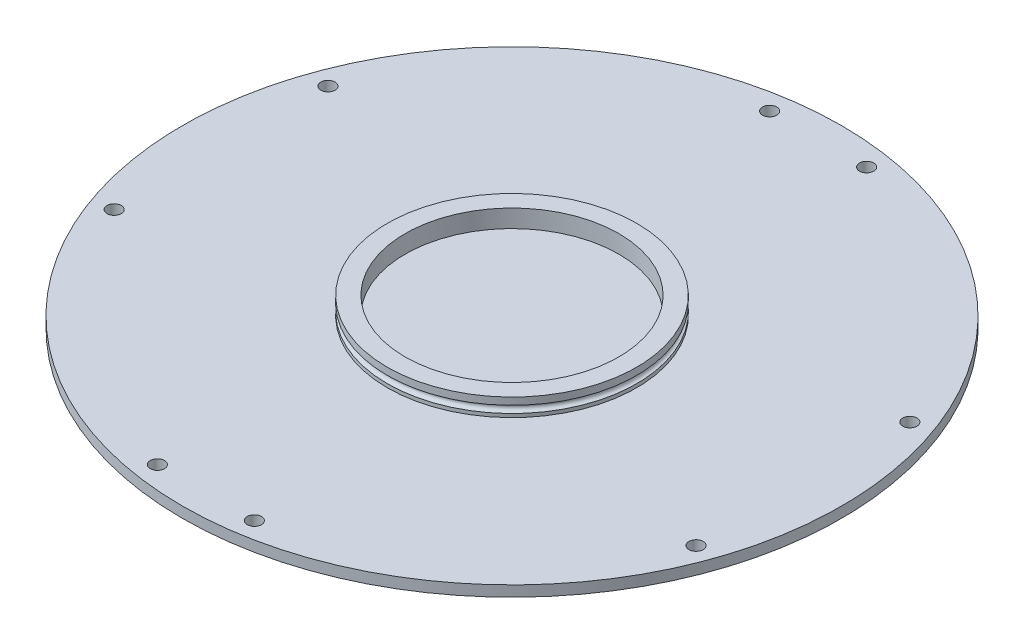
ISO-10303-21;
HEADER;
FILE_DESCRIPTION(('STEP AP214'),'2;1');
FILE_NAME('part.step','',(''),(''),'','','');
FILE_SCHEMA(('AUTOMOTIVE_DESIGN { 1 0 10303 214 1 1 1 1 }'));
ENDSEC;
DATA;
#1=APPLICATION_CONTEXT('core data for automotive mechanical design processes');
#2=APPLICATION_PROTOCOL_DEFINITION('international standard','automotive_design',2000,#1);
#3=PRODUCT_CONTEXT('',#1,'mechanical');
#4=PRODUCT('Part','Part','',(#3));
#5=PRODUCT_RELATED_PRODUCT_CATEGORY('part','',(#4));
#6=PRODUCT_DEFINITION_FORMATION('','',#4);
#7=PRODUCT_DEFINITION_CONTEXT('part definition',#1,'design');
#8=PRODUCT_DEFINITION('design','',#6,#7);
#9=PRODUCT_DEFINITION_SHAPE('','',#8);
#10=(LENGTH_UNIT() NAMED_UNIT(*) SI_UNIT(.MILLI.,.METRE.));
#11=(NAMED_UNIT(*) PLANE_ANGLE_UNIT() SI_UNIT($,.RADIAN.));
#12=(NAMED_UNIT(*) SI_UNIT($,.STERADIAN.) SOLID_ANGLE_UNIT());
#13=UNCERTAINTY_MEASURE_WITH_UNIT(LENGTH_MEASURE(1.E-05),#10,'distance_accuracy_value','');
#14=(GEOMETRIC_REPRESENTATION_CONTEXT(3) GLOBAL_UNCERTAINTY_ASSIGNED_CONTEXT((#13)) GLOBAL_UNIT_ASSIGNED_CONTEXT((#10,
#11,#12)) REPRESENTATION_CONTEXT('',''));
#15=CARTESIAN_POINT('',(0.,0.,0.));
#16=DIRECTION('',(0.,0.,1.));
#17=DIRECTION('',(1.,0.,0.));
#18=AXIS2_PLACEMENT_3D('',#15,#16,#17);
#19=CARTESIAN_POINT('',(0.,8.,0.));
#20=DIRECTION('',(0.,-1.,0.));
#21=DIRECTION('',(0.,0.,-1.));
#22=AXIS2_PLACEMENT_3D('',#19,#20,#21);
#23=CYLINDRICAL_SURFACE('',#22,35.);
#24=CARTESIAN_POINT('',(0.,4.,0.));
#25=DIRECTION('',(0.,-1.,0.));
#26=DIRECTION('',(0.,0.,-1.));
#27=AXIS2_PLACEMENT_3D('',#24,#25,#26);
#28=CIRCLE('',#27,35.);
#29=CARTESIAN_POINT('',(0.,4.,-35.));
#30=VERTEX_POINT('',#29);
#31=EDGE_CURVE('E174',#30,#30,#28,.T.);
#32=ORIENTED_EDGE('',*,*,#31,.T.);
#33=EDGE_LOOP('',(#32));
#34=FACE_BOUND('',#33,.T.);
#35=CARTESIAN_POINT('',(0.,3.,0.));
#36=DIRECTION('',(0.,1.,0.));
#37=DIRECTION('',(0.,0.,1.));
#38=AXIS2_PLACEMENT_3D('',#35,#36,#37);
#39=CIRCLE('',#38,35.);
#40=CARTESIAN_POINT('',(0.,3.,35.));
#41=VERTEX_POINT('',#40);
#42=EDGE_CURVE('E97',#41,#41,#39,.T.);
#43=ORIENTED_EDGE('',*,*,#42,.T.);
#44=EDGE_LOOP('',(#43));
#45=FACE_BOUND('',#44,.T.);
#46=ADVANCED_FACE('F39',(#34,#45),#23,.T.);
#47=CARTESIAN_POINT('',(0.,3.,0.));
#48=DIRECTION('',(0.,-1.,0.));
#49=DIRECTION('',(0.,0.,-1.));
#50=AXIS2_PLACEMENT_3D('',#47,#48,#49);
#51=CYLINDRICAL_SURFACE('',#50,92.5);
#52=CARTESIAN_POINT('',(0.,3.,0.));
#53=DIRECTION('',(0.,1.,0.));
#54=DIRECTION('',(0.,0.,1.));
#55=AXIS2_PLACEMENT_3D('',#52,#53,#54);
#56=CIRCLE('',#55,92.5);
#57=CARTESIAN_POINT('',(0.,3.,92.5));
#58=VERTEX_POINT('',#57);
#59=EDGE_CURVE('E46',#58,#58,#56,.T.);
#60=ORIENTED_EDGE('',*,*,#59,.F.);
#61=EDGE_LOOP('',(#60));
#62=FACE_BOUND('',#61,.T.);
#63=CARTESIAN_POINT('',(0.,0.,0.));
#64=DIRECTION('',(0.,1.,0.));
#65=DIRECTION('',(0.,0.,1.));
#66=AXIS2_PLACEMENT_3D('',#63,#64,#65);
#67=CIRCLE('',#66,92.5);
#68=CARTESIAN_POINT('',(0.,0.,92.5));
#69=VERTEX_POINT('',#68);
#70=EDGE_CURVE('E83',#69,#69,#67,.T.);
#71=ORIENTED_EDGE('',*,*,#70,.T.);
#72=EDGE_LOOP('',(#71));
#73=FACE_BOUND('',#72,.T.);
#74=ADVANCED_FACE('F129',(#62,#73),#51,.T.);
#75=CARTESIAN_POINT('',(-81.6639455328972,3.,-30.));
#76=DIRECTION('',(0.,-1.,0.));
#77=DIRECTION('',(0.,0.,-1.));
#78=AXIS2_PLACEMENT_3D('',#75,#76,#77);
#79=CYLINDRICAL_SURFACE('',#78,2.);
#80=CARTESIAN_POINT('',(-81.6639455328972,3.,-30.));
#81=DIRECTION('',(0.,1.,0.));
#82=DIRECTION('',(0.,0.,1.));
#83=AXIS2_PLACEMENT_3D('',#80,#81,#82);
#84=CIRCLE('',#83,2.);
#85=CARTESIAN_POINT('',(-81.6639455328972,3.,-28.));
#86=VERTEX_POINT('',#85);
#87=EDGE_CURVE('E50',#86,#86,#84,.T.);
#88=ORIENTED_EDGE('',*,*,#87,.T.);
#89=EDGE_LOOP('',(#88));
#90=FACE_BOUND('',#89,.T.);
#91=CARTESIAN_POINT('',(-81.6639455328972,0.,-30.));
#92=DIRECTION('',(0.,1.,0.));
#93=DIRECTION('',(0.,0.,1.));
#94=AXIS2_PLACEMENT_3D('',#91,#92,#93);
#95=CIRCLE('',#94,2.);
#96=CARTESIAN_POINT('',(-81.6639455328972,0.,-28.));
#97=VERTEX_POINT('',#96);
#98=EDGE_CURVE('E81',#97,#97,#95,.T.);
#99=ORIENTED_EDGE('',*,*,#98,.F.);
#100=EDGE_LOOP('',(#99));
#101=FACE_BOUND('',#100,.T.);
#102=ADVANCED_FACE('F126',(#90,#101),#79,.F.);
#103=CARTESIAN_POINT('',(81.6639455328972,3.,-30.));
#104=DIRECTION('',(0.,-1.,0.));
#105=DIRECTION('',(0.,0.,-1.));
#106=AXIS2_PLACEMENT_3D('',#103,#104,#105);
#107=CYLINDRICAL_SURFACE('',#106,2.);
#108=CARTESIAN_POINT('',(81.6639455328972,3.,-30.));
#109=DIRECTION('',(0.,1.,0.));
#110=DIRECTION('',(0.,0.,1.));
#111=AXIS2_PLACEMENT_3D('',#108,#109,#110);
#112=CIRCLE('',#111,2.);
#113=CARTESIAN_POINT('',(81.6639455328972,3.,-28.));
#114=VERTEX_POINT('',#113);
#115=EDGE_CURVE('E55',#114,#114,#112,.T.);
#116=ORIENTED_EDGE('',*,*,#115,.T.);
#117=EDGE_LOOP('',(#116));
#118=FACE_BOUND('',#117,.T.);
#119=CARTESIAN_POINT('',(81.6639455328972,0.,-30.));
#120=DIRECTION('',(0.,1.,0.));
#121=DIRECTION('',(0.,0.,1.));
#122=AXIS2_PLACEMENT_3D('',#119,#120,#121);
#123=CIRCLE('',#122,2.);
#124=CARTESIAN_POINT('',(81.6639455328972,0.,-28.));
#125=VERTEX_POINT('',#124);
#126=EDGE_CURVE('E78',#125,#125,#123,.T.);
#127=ORIENTED_EDGE('',*,*,#126,.F.);
#128=EDGE_LOOP('',(#127));
#129=FACE_BOUND('',#128,.T.);
#130=ADVANCED_FACE('F113',(#118,#129),#107,.F.);
#131=CARTESIAN_POINT('',(13.6097984585005,3.,-85.9288856317769));
#132=DIRECTION('',(0.,-1.,0.));
#133=DIRECTION('',(0.,0.,-1.));
#134=AXIS2_PLACEMENT_3D('',#131,#132,#133);
#135=CYLINDRICAL_SURFACE('',#134,2.);
#136=CARTESIAN_POINT('',(13.6097984585005,3.,-85.9288856317769));
#137=DIRECTION('',(0.,1.,0.));
#138=DIRECTION('',(0.,0.,1.));
#139=AXIS2_PLACEMENT_3D('',#136,#137,#138);
#140=CIRCLE('',#139,2.);
#141=CARTESIAN_POINT('',(13.6097984585005,3.,-83.9288856317769));
#142=VERTEX_POINT('',#141);
#143=EDGE_CURVE('E108',#142,#142,#140,.T.);
#144=ORIENTED_EDGE('',*,*,#143,.T.);
#145=EDGE_LOOP('',(#144));
#146=FACE_BOUND('',#145,.T.);
#147=CARTESIAN_POINT('',(13.6097984585005,0.,-85.9288856317769));
#148=DIRECTION('',(0.,1.,0.));
#149=DIRECTION('',(0.,0.,1.));
#150=AXIS2_PLACEMENT_3D('',#147,#148,#149);
#151=CIRCLE('',#150,2.);
#152=CARTESIAN_POINT('',(13.6097984585005,0.,-83.9288856317769));
#153=VERTEX_POINT('',#152);
#154=EDGE_CURVE('E75',#153,#153,#151,.T.);
#155=ORIENTED_EDGE('',*,*,#154,.F.);
#156=EDGE_LOOP('',(#155));
#157=FACE_BOUND('',#156,.T.);
#158=ADVANCED_FACE('F275',(#146,#157),#135,.F.);
#159=CARTESIAN_POINT('',(13.6097984585005,3.,85.9288856317769));
#160=DIRECTION('',(0.,-1.,0.));
#161=DIRECTION('',(0.,0.,-1.));
#162=AXIS2_PLACEMENT_3D('',#159,#160,#161);
#163=CYLINDRICAL_SURFACE('',#162,2.);
#164=CARTESIAN_POINT('',(13.6097984585005,3.,85.9288856317769));
#165=DIRECTION('',(0.,1.,0.));
#166=DIRECTION('',(0.,0.,1.));
#167=AXIS2_PLACEMENT_3D('',#164,#165,#166);
#168=CIRCLE('',#167,2.);
#169=CARTESIAN_POINT('',(13.6097984585005,3.,87.9288856317769));
#170=VERTEX_POINT('',#169);
#171=EDGE_CURVE('E105',#170,#170,#168,.T.);
#172=ORIENTED_EDGE('',*,*,#171,.T.);
#173=EDGE_LOOP('',(#172));
#174=FACE_BOUND('',#173,.T.);
#175=CARTESIAN_POINT('',(13.6097984585005,0.,85.9288856317769));
#176=DIRECTION('',(0.,1.,0.));
#177=DIRECTION('',(0.,0.,1.));
#178=AXIS2_PLACEMENT_3D('',#175,#176,#177);
#179=CIRCLE('',#178,2.);
#180=CARTESIAN_POINT('',(13.6097984585005,0.,87.9288856317769));
#181=VERTEX_POINT('',#180);
#182=EDGE_CURVE('E72',#181,#181,#179,.T.);
#183=ORIENTED_EDGE('',*,*,#182,.F.);
#184=EDGE_LOOP('',(#183));
#185=FACE_BOUND('',#184,.T.);
#186=ADVANCED_FACE('F265',(#174,#185),#163,.F.);
#187=CARTESIAN_POINT('',(-13.6097984585005,3.,-85.9288856317769));
#188=DIRECTION('',(0.,-1.,0.));
#189=DIRECTION('',(0.,0.,-1.));
#190=AXIS2_PLACEMENT_3D('',#187,#188,#189);
#191=CYLINDRICAL_SURFACE('',#190,1.99999999999994);
#192=CARTESIAN_POINT('',(-13.6097984585005,3.,-85.9288856317769));
#193=DIRECTION('',(0.,1.,0.));
#194=DIRECTION('',(0.,0.,1.));
#195=AXIS2_PLACEMENT_3D('',#192,#193,#194);
#196=CIRCLE('',#195,1.99999999999994);
#197=CARTESIAN_POINT('',(-13.6097984585005,3.,-83.928885631777));
#198=VERTEX_POINT('',#197);
#199=EDGE_CURVE('E102',#198,#198,#196,.T.);
#200=ORIENTED_EDGE('',*,*,#199,.T.);
#201=EDGE_LOOP('',(#200));
#202=FACE_BOUND('',#201,.T.);
#203=CARTESIAN_POINT('',(-13.6097984585005,0.,-85.9288856317769));
#204=DIRECTION('',(0.,1.,0.));
#205=DIRECTION('',(0.,0.,1.));
#206=AXIS2_PLACEMENT_3D('',#203,#204,#205);
#207=CIRCLE('',#206,1.99999999999994);
#208=CARTESIAN_POINT('',(-13.6097984585005,0.,-83.928885631777));
#209=VERTEX_POINT('',#208);
#210=EDGE_CURVE('E69',#209,#209,#207,.T.);
#211=ORIENTED_EDGE('',*,*,#210,.F.);
#212=EDGE_LOOP('',(#211));
#213=FACE_BOUND('',#212,.T.);
#214=ADVANCED_FACE('F255',(#202,#213),#191,.F.);
#215=CARTESIAN_POINT('',(-13.6097984585005,3.,85.9288856317769));
#216=DIRECTION('',(0.,-1.,0.));
#217=DIRECTION('',(0.,0.,-1.));
#218=AXIS2_PLACEMENT_3D('',#215,#216,#217);
#219=CYLINDRICAL_SURFACE('',#218,1.99999999999996);
#220=CARTESIAN_POINT('',(-13.6097984585005,3.,85.9288856317769));
#221=DIRECTION('',(0.,1.,0.));
#222=DIRECTION('',(0.,0.,1.));
#223=AXIS2_PLACEMENT_3D('',#220,#221,#222);
#224=CIRCLE('',#223,1.99999999999996);
#225=CARTESIAN_POINT('',(-13.6097984585005,3.,87.9288856317769));
#226=VERTEX_POINT('',#225);
#227=EDGE_CURVE('E94',#226,#226,#224,.T.);
#228=ORIENTED_EDGE('',*,*,#227,.T.);
#229=EDGE_LOOP('',(#228));
#230=FACE_BOUND('',#229,.T.);
#231=CARTESIAN_POINT('',(-13.6097984585005,0.,85.9288856317769));
#232=DIRECTION('',(0.,1.,0.));
#233=DIRECTION('',(0.,0.,1.));
#234=AXIS2_PLACEMENT_3D('',#231,#232,#233);
#235=CIRCLE('',#234,1.99999999999996);
#236=CARTESIAN_POINT('',(-13.6097984585005,0.,87.9288856317769));
#237=VERTEX_POINT('',#236);
#238=EDGE_CURVE('E66',#237,#237,#235,.T.);
#239=ORIENTED_EDGE('',*,*,#238,.F.);
#240=EDGE_LOOP('',(#239));
#241=FACE_BOUND('',#240,.T.);
#242=ADVANCED_FACE('F246',(#230,#241),#219,.F.);
#243=CARTESIAN_POINT('',(81.6639455328972,3.,30.));
#244=DIRECTION('',(0.,-1.,0.));
#245=DIRECTION('',(0.,0.,-1.));
#246=AXIS2_PLACEMENT_3D('',#243,#244,#245);
#247=CYLINDRICAL_SURFACE('',#246,2.);
#248=CARTESIAN_POINT('',(81.6639455328972,3.,30.));
#249=DIRECTION('',(0.,1.,0.));
#250=DIRECTION('',(0.,0.,1.));
#251=AXIS2_PLACEMENT_3D('',#248,#249,#250);
#252=CIRCLE('',#251,2.);
#253=CARTESIAN_POINT('',(81.6639455328972,3.,32.));
#254=VERTEX_POINT('',#253);
#255=EDGE_CURVE('E89',#254,#254,#252,.T.);
#256=ORIENTED_EDGE('',*,*,#255,.T.);
#257=EDGE_LOOP('',(#256));
#258=FACE_BOUND('',#257,.T.);
#259=CARTESIAN_POINT('',(81.6639455328972,0.,30.));
#260=DIRECTION('',(0.,1.,0.));
#261=DIRECTION('',(0.,0.,1.));
#262=AXIS2_PLACEMENT_3D('',#259,#260,#261);
#263=CIRCLE('',#262,2.);
#264=CARTESIAN_POINT('',(81.6639455328972,0.,32.));
#265=VERTEX_POINT('',#264);
#266=EDGE_CURVE('E62',#265,#265,#263,.T.);
#267=ORIENTED_EDGE('',*,*,#266,.F.);
#268=EDGE_LOOP('',(#267));
#269=FACE_BOUND('',#268,.T.);
#270=ADVANCED_FACE('F140',(#258,#269),#247,.F.);
#271=CARTESIAN_POINT('',(-81.6639455328972,3.,30.));
#272=DIRECTION('',(0.,-1.,0.));
#273=DIRECTION('',(0.,0.,-1.));
#274=AXIS2_PLACEMENT_3D('',#271,#272,#273);
#275=CYLINDRICAL_SURFACE('',#274,2.);
#276=CARTESIAN_POINT('',(-81.6639455328972,3.,30.));
#277=DIRECTION('',(0.,1.,0.));
#278=DIRECTION('',(0.,0.,1.));
#279=AXIS2_PLACEMENT_3D('',#276,#277,#278);
#280=CIRCLE('',#279,2.);
#281=CARTESIAN_POINT('',(-81.6639455328972,3.,32.));
#282=VERTEX_POINT('',#281);
#283=EDGE_CURVE('E85',#282,#282,#280,.T.);
#284=ORIENTED_EDGE('',*,*,#283,.T.);
#285=EDGE_LOOP('',(#284));
#286=FACE_BOUND('',#285,.T.);
#287=CARTESIAN_POINT('',(-81.6639455328972,0.,30.));
#288=DIRECTION('',(0.,1.,0.));
#289=DIRECTION('',(0.,0.,1.));
#290=AXIS2_PLACEMENT_3D('',#287,#288,#289);
#291=CIRCLE('',#290,2.);
#292=CARTESIAN_POINT('',(-81.6639455328972,0.,32.));
#293=VERTEX_POINT('',#292);
#294=EDGE_CURVE('E59',#293,#293,#291,.T.);
#295=ORIENTED_EDGE('',*,*,#294,.F.);
#296=EDGE_LOOP('',(#295));
#297=FACE_BOUND('',#296,.T.);
#298=ADVANCED_FACE('F41',(#286,#297),#275,.F.);
#299=CARTESIAN_POINT('',(0.,0.,0.));
#300=DIRECTION('',(0.,1.,0.));
#301=DIRECTION('',(0.,0.,1.));
#302=AXIS2_PLACEMENT_3D('',#299,#300,#301);
#303=PLANE('',#302);
#304=ORIENTED_EDGE('',*,*,#294,.T.);
#305=EDGE_LOOP('',(#304));
#306=FACE_BOUND('',#305,.T.);
#307=ORIENTED_EDGE('',*,*,#266,.T.);
#308=EDGE_LOOP('',(#307));
#309=FACE_BOUND('',#308,.T.);
#310=ORIENTED_EDGE('',*,*,#238,.T.);
#311=EDGE_LOOP('',(#310));
#312=FACE_BOUND('',#311,.T.);
#313=ORIENTED_EDGE('',*,*,#210,.T.);
#314=EDGE_LOOP('',(#313));
#315=FACE_BOUND('',#314,.T.);
#316=ORIENTED_EDGE('',*,*,#182,.T.);
#317=EDGE_LOOP('',(#316));
#318=FACE_BOUND('',#317,.T.);
#319=ORIENTED_EDGE('',*,*,#154,.T.);
#320=EDGE_LOOP('',(#319));
#321=FACE_BOUND('',#320,.T.);
#322=ORIENTED_EDGE('',*,*,#126,.T.);
#323=EDGE_LOOP('',(#322));
#324=FACE_BOUND('',#323,.T.);
#325=ORIENTED_EDGE('',*,*,#98,.T.);
#326=EDGE_LOOP('',(#325));
#327=FACE_BOUND('',#326,.T.);
#328=ORIENTED_EDGE('',*,*,#70,.F.);
#329=EDGE_LOOP('',(#328));
#330=FACE_BOUND('',#329,.T.);
#331=ADVANCED_FACE('F120',(#306,#309,#312,#315,#318,#321,#324,#327,#330),#303,.F.);
#332=CARTESIAN_POINT('',(0.,3.,0.));
#333=DIRECTION('',(0.,1.,0.));
#334=DIRECTION('',(0.,0.,1.));
#335=AXIS2_PLACEMENT_3D('',#332,#333,#334);
#336=PLANE('',#335);
#337=ORIENTED_EDGE('',*,*,#42,.F.);
#338=EDGE_LOOP('',(#337));
#339=FACE_BOUND('',#338,.T.);
#340=ORIENTED_EDGE('',*,*,#283,.F.);
#341=EDGE_LOOP('',(#340));
#342=FACE_BOUND('',#341,.T.);
#343=ORIENTED_EDGE('',*,*,#255,.F.);
#344=EDGE_LOOP('',(#343));
#345=FACE_BOUND('',#344,.T.);
#346=ORIENTED_EDGE('',*,*,#227,.F.);
#347=EDGE_LOOP('',(#346));
#348=FACE_BOUND('',#347,.T.);
#349=ORIENTED_EDGE('',*,*,#199,.F.);
#350=EDGE_LOOP('',(#349));
#351=FACE_BOUND('',#350,.T.);
#352=ORIENTED_EDGE('',*,*,#171,.F.);
#353=EDGE_LOOP('',(#352));
#354=FACE_BOUND('',#353,.T.);
#355=ORIENTED_EDGE('',*,*,#143,.F.);
#356=EDGE_LOOP('',(#355));
#357=FACE_BOUND('',#356,.T.);
#358=ORIENTED_EDGE('',*,*,#115,.F.);
#359=EDGE_LOOP('',(#358));
#360=FACE_BOUND('',#359,.T.);
#361=ORIENTED_EDGE('',*,*,#87,.F.);
#362=EDGE_LOOP('',(#361));
#363=FACE_BOUND('',#362,.T.);
#364=ORIENTED_EDGE('',*,*,#59,.T.);
#365=EDGE_LOOP('',(#364));
#366=FACE_BOUND('',#365,.T.);
#367=ADVANCED_FACE('F116',(#339,#342,#345,#348,#351,#354,#357,#360,#363,#366),#336,.T.);
#368=CARTESIAN_POINT('',(0.,5.,0.));
#369=DIRECTION('',(0.,-1.,0.));
#370=DIRECTION('',(0.,0.,-1.));
#371=AXIS2_PLACEMENT_3D('',#368,#369,#370);
#372=TOROIDAL_SURFACE('',#371,35.,1.);
#373=ORIENTED_EDGE('',*,*,#31,.F.);
#374=EDGE_LOOP('',(#373));
#375=FACE_BOUND('',#374,.T.);
#376=CARTESIAN_POINT('',(0.,6.,0.));
#377=DIRECTION('',(0.,-1.,0.));
#378=DIRECTION('',(0.,0.,-1.));
#379=AXIS2_PLACEMENT_3D('',#376,#377,#378);
#380=CIRCLE('',#379,35.);
#381=CARTESIAN_POINT('',(0.,6.,-35.));
#382=VERTEX_POINT('',#381);
#383=EDGE_CURVE('E166',#382,#382,#380,.T.);
#384=ORIENTED_EDGE('',*,*,#383,.T.);
#385=EDGE_LOOP('',(#384));
#386=FACE_BOUND('',#385,.T.);
#387=ADVANCED_FACE('F119',(#375,#386),#372,.F.);
#388=CARTESIAN_POINT('',(0.,3.,0.));
#389=DIRECTION('',(0.,1.,0.));
#390=DIRECTION('',(0.,0.,1.));
#391=AXIS2_PLACEMENT_3D('',#388,#389,#390);
#392=CIRCLE('',#391,30.);
#393=CARTESIAN_POINT('',(0.,3.,30.));
#394=VERTEX_POINT('',#393);
#395=EDGE_CURVE('E11',#394,#394,#392,.F.);
#396=ORIENTED_EDGE('',*,*,#395,.F.);
#397=EDGE_LOOP('',(#396));
#398=FACE_BOUND('',#397,.T.);
#399=ADVANCED_FACE('F123',(#398),#336,.T.);
#400=CARTESIAN_POINT('',(0.,8.,0.));
#401=DIRECTION('',(0.,-1.,0.));
#402=DIRECTION('',(0.,0.,-1.));
#403=AXIS2_PLACEMENT_3D('',#400,#401,#402);
#404=CYLINDRICAL_SURFACE('',#403,30.);
#405=CARTESIAN_POINT('',(0.,8.,0.));
#406=DIRECTION('',(0.,1.,0.));
#407=DIRECTION('',(0.,0.,1.));
#408=AXIS2_PLACEMENT_3D('',#405,#406,#407);
#409=CIRCLE('',#408,30.);
#410=CARTESIAN_POINT('',(0.,8.,30.));
#411=VERTEX_POINT('',#410);
#412=EDGE_CURVE('E170',#411,#411,#409,.T.);
#413=ORIENTED_EDGE('',*,*,#412,.T.);
#414=EDGE_LOOP('',(#413));
#415=FACE_BOUND('',#414,.T.);
#416=ORIENTED_EDGE('',*,*,#395,.T.);
#417=EDGE_LOOP('',(#416));
#418=FACE_BOUND('',#417,.T.);
#419=ADVANCED_FACE('F161',(#415,#418),#404,.F.);
#420=CARTESIAN_POINT('',(0.,8.,0.));
#421=DIRECTION('',(0.,1.,0.));
#422=DIRECTION('',(0.,0.,1.));
#423=AXIS2_PLACEMENT_3D('',#420,#421,#422);
#424=PLANE('',#423);
#425=ORIENTED_EDGE('',*,*,#412,.F.);
#426=EDGE_LOOP('',(#425));
#427=FACE_BOUND('',#426,.T.);
#428=CARTESIAN_POINT('',(0.,8.,0.));
#429=DIRECTION('',(0.,1.,0.));
#430=DIRECTION('',(0.,0.,1.));
#431=AXIS2_PLACEMENT_3D('',#428,#429,#430);
#432=CIRCLE('',#431,35.);
#433=CARTESIAN_POINT('',(0.,8.,35.));
#434=VERTEX_POINT('',#433);
#435=EDGE_CURVE('E63',#434,#434,#432,.T.);
#436=ORIENTED_EDGE('',*,*,#435,.T.);
#437=EDGE_LOOP('',(#436));
#438=FACE_BOUND('',#437,.T.);
#439=ADVANCED_FACE('F156',(#427,#438),#424,.T.);
#440=ORIENTED_EDGE('',*,*,#383,.F.);
#441=EDGE_LOOP('',(#440));
#442=FACE_BOUND('',#441,.T.);
#443=ORIENTED_EDGE('',*,*,#435,.F.);
#444=EDGE_LOOP('',(#443));
#445=FACE_BOUND('',#444,.T.);
#446=ADVANCED_FACE('F146',(#442,#445),#23,.T.);
#447=CLOSED_SHELL('',(#46,#74,#102,#130,#158,#186,#214,#242,#270,#298,#331,#367,#387,#399,#419,
#439,#446));
#448=MANIFOLD_SOLID_BREP('B2',#447);
#449=ADVANCED_BREP_SHAPE_REPRESENTATION('',(#18,#448),#14);
#450=SHAPE_DEFINITION_REPRESENTATION(#9,#449);
ENDSEC;
END-ISO-10303-21;
